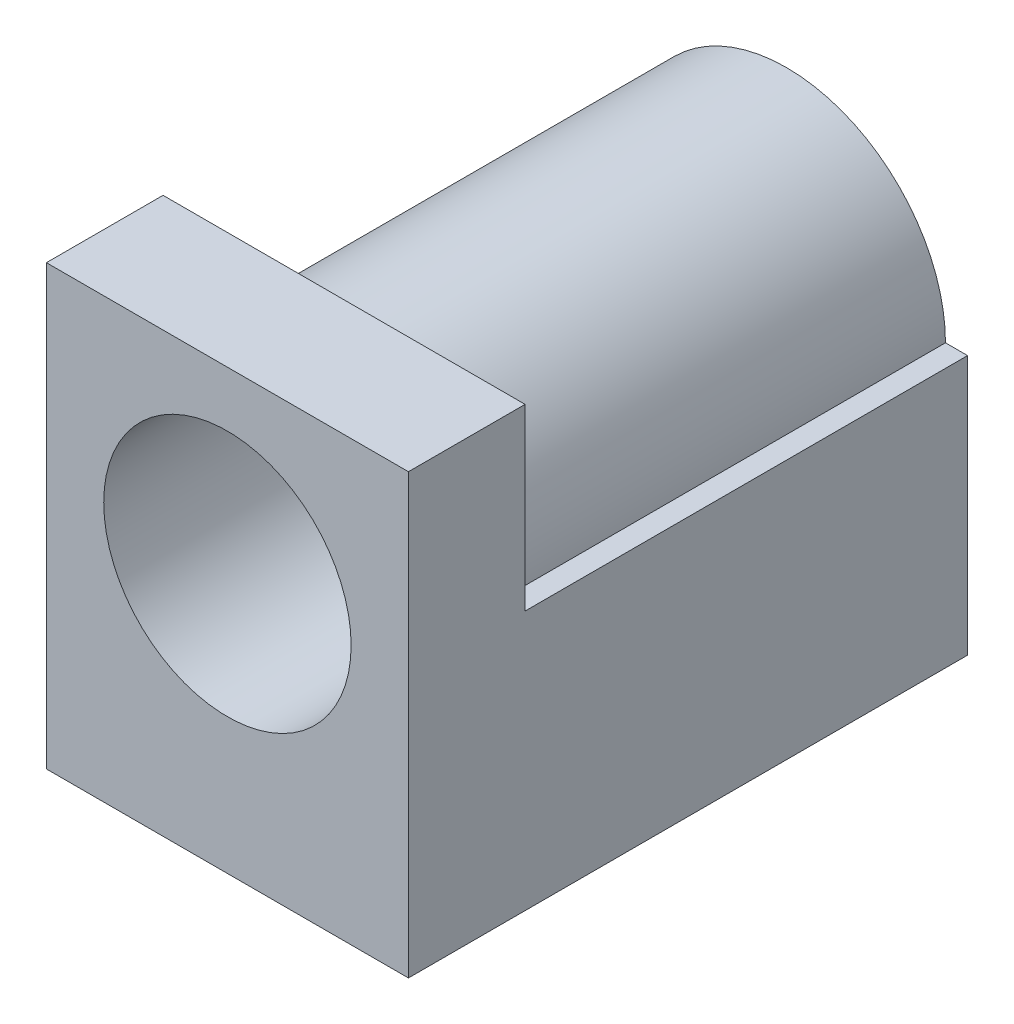
ISO-10303-21;
HEADER;
FILE_DESCRIPTION(('STEP AP214'),'2;1');
FILE_NAME('part.step','',(''),(''),'','','');
FILE_SCHEMA(('AUTOMOTIVE_DESIGN { 1 0 10303 214 1 1 1 1 }'));
ENDSEC;
DATA;
#1=APPLICATION_CONTEXT('core data for automotive mechanical design processes');
#2=APPLICATION_PROTOCOL_DEFINITION('international standard','automotive_design',2000,#1);
#3=PRODUCT_CONTEXT('',#1,'mechanical');
#4=PRODUCT('Part','Part','',(#3));
#5=PRODUCT_RELATED_PRODUCT_CATEGORY('part','',(#4));
#6=PRODUCT_DEFINITION_FORMATION('','',#4);
#7=PRODUCT_DEFINITION_CONTEXT('part definition',#1,'design');
#8=PRODUCT_DEFINITION('design','',#6,#7);
#9=PRODUCT_DEFINITION_SHAPE('','',#8);
#10=(LENGTH_UNIT() NAMED_UNIT(*) SI_UNIT(.MILLI.,.METRE.));
#11=(NAMED_UNIT(*) PLANE_ANGLE_UNIT() SI_UNIT($,.RADIAN.));
#12=(NAMED_UNIT(*) SI_UNIT($,.STERADIAN.) SOLID_ANGLE_UNIT());
#13=UNCERTAINTY_MEASURE_WITH_UNIT(LENGTH_MEASURE(1.E-05),#10,'distance_accuracy_value','');
#14=(GEOMETRIC_REPRESENTATION_CONTEXT(3) GLOBAL_UNCERTAINTY_ASSIGNED_CONTEXT((#13)) GLOBAL_UNIT_ASSIGNED_CONTEXT((#10,
#11,#12)) REPRESENTATION_CONTEXT('',''));
#15=CARTESIAN_POINT('',(0.,0.,0.));
#16=DIRECTION('',(0.,0.,1.));
#17=DIRECTION('',(1.,0.,0.));
#18=AXIS2_PLACEMENT_3D('',#15,#16,#17);
#19=CARTESIAN_POINT('',(0.,0.,0.));
#20=DIRECTION('',(0.,0.,1.));
#21=DIRECTION('',(1.,0.,0.));
#22=AXIS2_PLACEMENT_3D('',#19,#20,#21);
#23=PLANE('',#22);
#24=DIRECTION('',(1.,0.,0.));
#25=VECTOR('',#24,1.);
#26=CARTESIAN_POINT('',(-3.95,0.999999999999999,0.));
#27=LINE('',#26,#25);
#28=CARTESIAN_POINT('',(-4.5,0.999999999999999,0.));
#29=VERTEX_POINT('',#28);
#30=CARTESIAN_POINT('',(-3.95,0.999999999999999,0.));
#31=VERTEX_POINT('',#30);
#32=EDGE_CURVE('E114',#29,#31,#27,.T.);
#33=ORIENTED_EDGE('',*,*,#32,.F.);
#34=DIRECTION('',(0.,-1.,0.));
#35=VECTOR('',#34,1.);
#36=CARTESIAN_POINT('',(-4.5,5.45,0.));
#37=LINE('',#36,#35);
#38=CARTESIAN_POINT('',(-4.5,5.45,0.));
#39=VERTEX_POINT('',#38);
#40=EDGE_CURVE('E117',#39,#29,#37,.T.);
#41=ORIENTED_EDGE('',*,*,#40,.F.);
#42=DIRECTION('',(-1.,0.,0.));
#43=VECTOR('',#42,1.);
#44=CARTESIAN_POINT('',(-4.5,5.45,0.));
#45=LINE('',#44,#43);
#46=CARTESIAN_POINT('',(4.5,5.45,0.));
#47=VERTEX_POINT('',#46);
#48=EDGE_CURVE('E130',#47,#39,#45,.T.);
#49=ORIENTED_EDGE('',*,*,#48,.F.);
#50=DIRECTION('',(0.,1.,0.));
#51=VECTOR('',#50,1.);
#52=CARTESIAN_POINT('',(4.5,5.45,0.));
#53=LINE('',#52,#51);
#54=CARTESIAN_POINT('',(4.5,0.999999999999999,0.));
#55=VERTEX_POINT('',#54);
#56=EDGE_CURVE('E120',#55,#47,#53,.T.);
#57=ORIENTED_EDGE('',*,*,#56,.F.);
#58=DIRECTION('',(1.,0.,0.));
#59=VECTOR('',#58,1.);
#60=CARTESIAN_POINT('',(3.95,0.999999999999999,0.));
#61=LINE('',#60,#59);
#62=CARTESIAN_POINT('',(3.95,0.999999999999999,0.));
#63=VERTEX_POINT('',#62);
#64=EDGE_CURVE('E52',#63,#55,#61,.T.);
#65=ORIENTED_EDGE('',*,*,#64,.F.);
#66=CARTESIAN_POINT('',(0.,0.999999999999999,0.));
#67=DIRECTION('',(0.,0.,-1.));
#68=DIRECTION('',(-1.,0.,0.));
#69=AXIS2_PLACEMENT_3D('',#66,#67,#68);
#70=CIRCLE('',#69,3.95);
#71=EDGE_CURVE('E47',#31,#63,#70,.T.);
#72=ORIENTED_EDGE('',*,*,#71,.F.);
#73=EDGE_LOOP('',(#33,#41,#49,#57,#65,#72));
#74=FACE_BOUND('',#73,.T.);
#75=ADVANCED_FACE('F32',(#74),#23,.F.);
#76=CARTESIAN_POINT('',(-4.5,5.45,2.9));
#77=DIRECTION('',(1.,0.,0.));
#78=DIRECTION('',(0.,1.,0.));
#79=AXIS2_PLACEMENT_3D('',#76,#77,#78);
#80=PLANE('',#79);
#81=ORIENTED_EDGE('',*,*,#40,.T.);
#82=DIRECTION('',(0.,0.,1.));
#83=VECTOR('',#82,1.);
#84=CARTESIAN_POINT('',(-4.5,0.999999999999999,-11.));
#85=LINE('',#84,#83);
#86=CARTESIAN_POINT('',(-4.5,0.999999999999999,-11.));
#87=VERTEX_POINT('',#86);
#88=EDGE_CURVE('E122',#87,#29,#85,.T.);
#89=ORIENTED_EDGE('',*,*,#88,.F.);
#90=DIRECTION('',(0.,1.,0.));
#91=VECTOR('',#90,1.);
#92=CARTESIAN_POINT('',(-4.5,-5.45,-11.));
#93=LINE('',#92,#91);
#94=CARTESIAN_POINT('',(-4.5,-5.45,-11.));
#95=VERTEX_POINT('',#94);
#96=EDGE_CURVE('E156',#95,#87,#93,.T.);
#97=ORIENTED_EDGE('',*,*,#96,.F.);
#98=DIRECTION('',(0.,0.,-1.));
#99=VECTOR('',#98,1.);
#100=CARTESIAN_POINT('',(-4.5,-5.45,2.9));
#101=LINE('',#100,#99);
#102=CARTESIAN_POINT('',(-4.5,-5.45,2.9));
#103=VERTEX_POINT('',#102);
#104=EDGE_CURVE('E11',#103,#95,#101,.T.);
#105=ORIENTED_EDGE('',*,*,#104,.F.);
#106=DIRECTION('',(0.,-1.,0.));
#107=VECTOR('',#106,1.);
#108=CARTESIAN_POINT('',(-4.5,5.45,2.9));
#109=LINE('',#108,#107);
#110=CARTESIAN_POINT('',(-4.5,5.45,2.9));
#111=VERTEX_POINT('',#110);
#112=EDGE_CURVE('E126',#111,#103,#109,.T.);
#113=ORIENTED_EDGE('',*,*,#112,.F.);
#114=DIRECTION('',(0.,0.,-1.));
#115=VECTOR('',#114,1.);
#116=CARTESIAN_POINT('',(-4.5,5.45,2.9));
#117=LINE('',#116,#115);
#118=EDGE_CURVE('E135',#111,#39,#117,.T.);
#119=ORIENTED_EDGE('',*,*,#118,.T.);
#120=EDGE_LOOP('',(#81,#89,#97,#105,#113,#119));
#121=FACE_BOUND('',#120,.T.);
#122=ADVANCED_FACE('F34',(#121),#80,.F.);
#123=CARTESIAN_POINT('',(-4.5,-5.45,2.9));
#124=DIRECTION('',(0.,1.,0.));
#125=DIRECTION('',(0.,0.,1.));
#126=AXIS2_PLACEMENT_3D('',#123,#124,#125);
#127=PLANE('',#126);
#128=ORIENTED_EDGE('',*,*,#104,.T.);
#129=DIRECTION('',(-1.,0.,0.));
#130=VECTOR('',#129,1.);
#131=CARTESIAN_POINT('',(4.5,-5.45,-11.));
#132=LINE('',#131,#130);
#133=CARTESIAN_POINT('',(4.5,-5.45,-11.));
#134=VERTEX_POINT('',#133);
#135=EDGE_CURVE('E151',#134,#95,#132,.T.);
#136=ORIENTED_EDGE('',*,*,#135,.F.);
#137=DIRECTION('',(0.,0.,-1.));
#138=VECTOR('',#137,1.);
#139=CARTESIAN_POINT('',(4.5,-5.45,2.9));
#140=LINE('',#139,#138);
#141=CARTESIAN_POINT('',(4.5,-5.45,2.9));
#142=VERTEX_POINT('',#141);
#143=EDGE_CURVE('E40',#142,#134,#140,.T.);
#144=ORIENTED_EDGE('',*,*,#143,.F.);
#145=DIRECTION('',(1.,0.,0.));
#146=VECTOR('',#145,1.);
#147=CARTESIAN_POINT('',(-4.5,-5.45,2.9));
#148=LINE('',#147,#146);
#149=EDGE_CURVE('E129',#103,#142,#148,.T.);
#150=ORIENTED_EDGE('',*,*,#149,.F.);
#151=EDGE_LOOP('',(#128,#136,#144,#150));
#152=FACE_BOUND('',#151,.T.);
#153=ADVANCED_FACE('F154',(#152),#127,.F.);
#154=CARTESIAN_POINT('',(4.5,5.45,2.9));
#155=DIRECTION('',(-1.,0.,0.));
#156=DIRECTION('',(0.,-1.,0.));
#157=AXIS2_PLACEMENT_3D('',#154,#155,#156);
#158=PLANE('',#157);
#159=ORIENTED_EDGE('',*,*,#143,.T.);
#160=DIRECTION('',(0.,-1.,0.));
#161=VECTOR('',#160,1.);
#162=CARTESIAN_POINT('',(4.5,0.999999999999999,-11.));
#163=LINE('',#162,#161);
#164=CARTESIAN_POINT('',(4.5,0.999999999999999,-11.));
#165=VERTEX_POINT('',#164);
#166=EDGE_CURVE('E104',#165,#134,#163,.T.);
#167=ORIENTED_EDGE('',*,*,#166,.F.);
#168=DIRECTION('',(0.,0.,1.));
#169=VECTOR('',#168,1.);
#170=CARTESIAN_POINT('',(4.5,0.999999999999999,-11.));
#171=LINE('',#170,#169);
#172=EDGE_CURVE('E100',#165,#55,#171,.T.);
#173=ORIENTED_EDGE('',*,*,#172,.T.);
#174=ORIENTED_EDGE('',*,*,#56,.T.);
#175=DIRECTION('',(0.,0.,-1.));
#176=VECTOR('',#175,1.);
#177=CARTESIAN_POINT('',(4.5,5.45,2.9));
#178=LINE('',#177,#176);
#179=CARTESIAN_POINT('',(4.5,5.45,2.9));
#180=VERTEX_POINT('',#179);
#181=EDGE_CURVE('E141',#180,#47,#178,.T.);
#182=ORIENTED_EDGE('',*,*,#181,.F.);
#183=DIRECTION('',(0.,1.,0.));
#184=VECTOR('',#183,1.);
#185=CARTESIAN_POINT('',(4.5,5.45,2.9));
#186=LINE('',#185,#184);
#187=EDGE_CURVE('E132',#142,#180,#186,.T.);
#188=ORIENTED_EDGE('',*,*,#187,.F.);
#189=EDGE_LOOP('',(#159,#167,#173,#174,#182,#188));
#190=FACE_BOUND('',#189,.T.);
#191=ADVANCED_FACE('F146',(#190),#158,.F.);
#192=CARTESIAN_POINT('',(-4.5,5.45,2.9));
#193=DIRECTION('',(0.,-1.,0.));
#194=DIRECTION('',(0.,0.,-1.));
#195=AXIS2_PLACEMENT_3D('',#192,#193,#194);
#196=PLANE('',#195);
#197=ORIENTED_EDGE('',*,*,#48,.T.);
#198=ORIENTED_EDGE('',*,*,#118,.F.);
#199=DIRECTION('',(-1.,0.,0.));
#200=VECTOR('',#199,1.);
#201=CARTESIAN_POINT('',(-4.5,5.45,2.9));
#202=LINE('',#201,#200);
#203=EDGE_CURVE('E134',#180,#111,#202,.T.);
#204=ORIENTED_EDGE('',*,*,#203,.F.);
#205=ORIENTED_EDGE('',*,*,#181,.T.);
#206=EDGE_LOOP('',(#197,#198,#204,#205));
#207=FACE_BOUND('',#206,.T.);
#208=ADVANCED_FACE('F176',(#207),#196,.F.);
#209=CARTESIAN_POINT('',(0.,0.,2.9));
#210=DIRECTION('',(0.,0.,1.));
#211=DIRECTION('',(1.,0.,0.));
#212=AXIS2_PLACEMENT_3D('',#209,#210,#211);
#213=PLANE('',#212);
#214=CARTESIAN_POINT('',(0.,0.999999999999999,2.9));
#215=DIRECTION('',(0.,0.,1.));
#216=DIRECTION('',(1.,0.,0.));
#217=AXIS2_PLACEMENT_3D('',#214,#215,#216);
#218=CIRCLE('',#217,3.075);
#219=CARTESIAN_POINT('',(3.075,0.999999999999999,2.9));
#220=VERTEX_POINT('',#219);
#221=EDGE_CURVE('E288',#220,#220,#218,.T.);
#222=ORIENTED_EDGE('',*,*,#221,.F.);
#223=EDGE_LOOP('',(#222));
#224=FACE_BOUND('',#223,.T.);
#225=ORIENTED_EDGE('',*,*,#112,.T.);
#226=ORIENTED_EDGE('',*,*,#149,.T.);
#227=ORIENTED_EDGE('',*,*,#187,.T.);
#228=ORIENTED_EDGE('',*,*,#203,.T.);
#229=EDGE_LOOP('',(#225,#226,#227,#228));
#230=FACE_BOUND('',#229,.T.);
#231=ADVANCED_FACE('F179',(#224,#230),#213,.T.);
#232=CARTESIAN_POINT('',(0.,0.999999999999999,-11.));
#233=DIRECTION('',(0.,0.,1.));
#234=DIRECTION('',(1.,0.,0.));
#235=AXIS2_PLACEMENT_3D('',#232,#233,#234);
#236=CYLINDRICAL_SURFACE('',#235,3.95);
#237=ORIENTED_EDGE('',*,*,#71,.T.);
#238=DIRECTION('',(0.,0.,1.));
#239=VECTOR('',#238,1.);
#240=CARTESIAN_POINT('',(3.95,0.999999999999999,-11.));
#241=LINE('',#240,#239);
#242=CARTESIAN_POINT('',(3.95,0.999999999999999,-11.));
#243=VERTEX_POINT('',#242);
#244=EDGE_CURVE('E98',#243,#63,#241,.T.);
#245=ORIENTED_EDGE('',*,*,#244,.F.);
#246=CARTESIAN_POINT('',(0.,0.999999999999999,-11.));
#247=DIRECTION('',(0.,0.,-1.));
#248=DIRECTION('',(-1.,0.,0.));
#249=AXIS2_PLACEMENT_3D('',#246,#247,#248);
#250=CIRCLE('',#249,3.95);
#251=CARTESIAN_POINT('',(-3.95,0.999999999999999,-11.));
#252=VERTEX_POINT('',#251);
#253=EDGE_CURVE('E105',#252,#243,#250,.T.);
#254=ORIENTED_EDGE('',*,*,#253,.F.);
#255=DIRECTION('',(0.,0.,1.));
#256=VECTOR('',#255,1.);
#257=CARTESIAN_POINT('',(-3.95,0.999999999999999,-11.));
#258=LINE('',#257,#256);
#259=EDGE_CURVE('E161',#252,#31,#258,.T.);
#260=ORIENTED_EDGE('',*,*,#259,.T.);
#261=EDGE_LOOP('',(#237,#245,#254,#260));
#262=FACE_BOUND('',#261,.T.);
#263=ADVANCED_FACE('F116',(#262),#236,.T.);
#264=CARTESIAN_POINT('',(3.95,0.999999999999999,-11.));
#265=DIRECTION('',(0.,-1.,0.));
#266=DIRECTION('',(0.,0.,-1.));
#267=AXIS2_PLACEMENT_3D('',#264,#265,#266);
#268=PLANE('',#267);
#269=ORIENTED_EDGE('',*,*,#64,.T.);
#270=ORIENTED_EDGE('',*,*,#172,.F.);
#271=DIRECTION('',(1.,0.,0.));
#272=VECTOR('',#271,1.);
#273=CARTESIAN_POINT('',(3.95,0.999999999999999,-11.));
#274=LINE('',#273,#272);
#275=EDGE_CURVE('E94',#243,#165,#274,.T.);
#276=ORIENTED_EDGE('',*,*,#275,.F.);
#277=ORIENTED_EDGE('',*,*,#244,.T.);
#278=EDGE_LOOP('',(#269,#270,#276,#277));
#279=FACE_BOUND('',#278,.T.);
#280=ADVANCED_FACE('F96',(#279),#268,.F.);
#281=CARTESIAN_POINT('',(-3.95,0.999999999999999,-11.));
#282=DIRECTION('',(0.,-1.,0.));
#283=DIRECTION('',(0.,0.,-1.));
#284=AXIS2_PLACEMENT_3D('',#281,#282,#283);
#285=PLANE('',#284);
#286=ORIENTED_EDGE('',*,*,#32,.T.);
#287=ORIENTED_EDGE('',*,*,#259,.F.);
#288=DIRECTION('',(1.,0.,0.));
#289=VECTOR('',#288,1.);
#290=CARTESIAN_POINT('',(-3.95,0.999999999999999,-11.));
#291=LINE('',#290,#289);
#292=EDGE_CURVE('E110',#87,#252,#291,.T.);
#293=ORIENTED_EDGE('',*,*,#292,.F.);
#294=ORIENTED_EDGE('',*,*,#88,.T.);
#295=EDGE_LOOP('',(#286,#287,#293,#294));
#296=FACE_BOUND('',#295,.T.);
#297=ADVANCED_FACE('F169',(#296),#285,.F.);
#298=CARTESIAN_POINT('',(0.,0.999999999999999,-11.));
#299=DIRECTION('',(0.,0.,-1.));
#300=DIRECTION('',(-1.,0.,0.));
#301=AXIS2_PLACEMENT_3D('',#298,#299,#300);
#302=PLANE('',#301);
#303=ORIENTED_EDGE('',*,*,#253,.T.);
#304=ORIENTED_EDGE('',*,*,#275,.T.);
#305=ORIENTED_EDGE('',*,*,#166,.T.);
#306=ORIENTED_EDGE('',*,*,#135,.T.);
#307=ORIENTED_EDGE('',*,*,#96,.T.);
#308=ORIENTED_EDGE('',*,*,#292,.T.);
#309=EDGE_LOOP('',(#303,#304,#305,#306,#307,#308));
#310=FACE_BOUND('',#309,.T.);
#311=ADVANCED_FACE('F108',(#310),#302,.T.);
#312=CARTESIAN_POINT('',(0.,0.999999999999999,-6.1));
#313=DIRECTION('',(0.,0.,1.));
#314=DIRECTION('',(1.,0.,0.));
#315=AXIS2_PLACEMENT_3D('',#312,#313,#314);
#316=CYLINDRICAL_SURFACE('',#315,3.075);
#317=CARTESIAN_POINT('',(0.,0.999999999999999,-6.1));
#318=DIRECTION('',(0.,0.,1.));
#319=DIRECTION('',(1.,0.,0.));
#320=AXIS2_PLACEMENT_3D('',#317,#318,#319);
#321=CIRCLE('',#320,3.075);
#322=CARTESIAN_POINT('',(3.075,0.999999999999999,-6.1));
#323=VERTEX_POINT('',#322);
#324=EDGE_CURVE('E163',#323,#323,#321,.T.);
#325=ORIENTED_EDGE('',*,*,#324,.F.);
#326=EDGE_LOOP('',(#325));
#327=FACE_BOUND('',#326,.T.);
#328=ORIENTED_EDGE('',*,*,#221,.T.);
#329=EDGE_LOOP('',(#328));
#330=FACE_BOUND('',#329,.T.);
#331=ADVANCED_FACE('F261',(#327,#330),#316,.F.);
#332=CARTESIAN_POINT('',(0.,0.999999999999999,-6.1));
#333=DIRECTION('',(0.,0.,1.));
#334=DIRECTION('',(1.,0.,0.));
#335=AXIS2_PLACEMENT_3D('',#332,#333,#334);
#336=PLANE('',#335);
#337=ORIENTED_EDGE('',*,*,#324,.T.);
#338=EDGE_LOOP('',(#337));
#339=FACE_BOUND('',#338,.T.);
#340=ADVANCED_FACE('F269',(#339),#336,.T.);
#341=CLOSED_SHELL('',(#75,#122,#153,#191,#208,#231,#263,#280,#297,#311,#331,#340));
#342=MANIFOLD_SOLID_BREP('B2',#341);
#343=ADVANCED_BREP_SHAPE_REPRESENTATION('',(#18,#342),#14);
#344=SHAPE_DEFINITION_REPRESENTATION(#9,#343);
ENDSEC;
END-ISO-10303-21;
